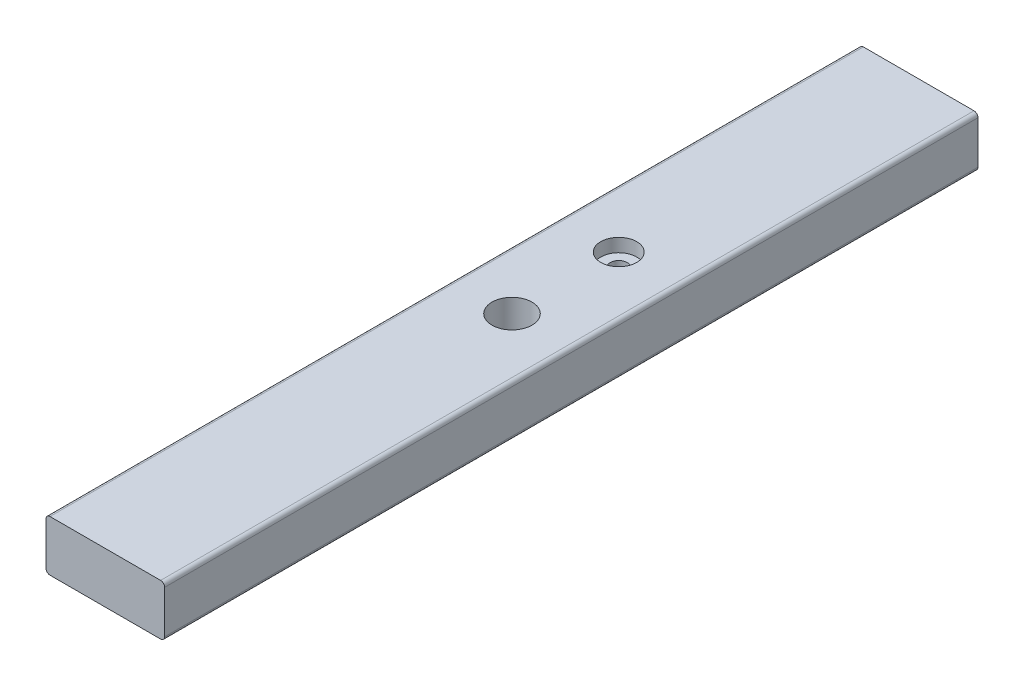
ISO-10303-21;
HEADER;
FILE_DESCRIPTION(('STEP AP214'),'2;1');
FILE_NAME('part.step','',(''),(''),'','','');
FILE_SCHEMA(('AUTOMOTIVE_DESIGN { 1 0 10303 214 1 1 1 1 }'));
ENDSEC;
DATA;
#1=APPLICATION_CONTEXT('core data for automotive mechanical design processes');
#2=APPLICATION_PROTOCOL_DEFINITION('international standard','automotive_design',2000,#1);
#3=PRODUCT_CONTEXT('',#1,'mechanical');
#4=PRODUCT('Part','Part','',(#3));
#5=PRODUCT_RELATED_PRODUCT_CATEGORY('part','',(#4));
#6=PRODUCT_DEFINITION_FORMATION('','',#4);
#7=PRODUCT_DEFINITION_CONTEXT('part definition',#1,'design');
#8=PRODUCT_DEFINITION('design','',#6,#7);
#9=PRODUCT_DEFINITION_SHAPE('','',#8);
#10=(LENGTH_UNIT() NAMED_UNIT(*) SI_UNIT(.MILLI.,.METRE.));
#11=(NAMED_UNIT(*) PLANE_ANGLE_UNIT() SI_UNIT($,.RADIAN.));
#12=(NAMED_UNIT(*) SI_UNIT($,.STERADIAN.) SOLID_ANGLE_UNIT());
#13=UNCERTAINTY_MEASURE_WITH_UNIT(LENGTH_MEASURE(1.E-05),#10,'distance_accuracy_value','');
#14=(GEOMETRIC_REPRESENTATION_CONTEXT(3) GLOBAL_UNCERTAINTY_ASSIGNED_CONTEXT((#13)) GLOBAL_UNIT_ASSIGNED_CONTEXT((#10,
#11,#12)) REPRESENTATION_CONTEXT('',''));
#15=CARTESIAN_POINT('',(0.,0.,0.));
#16=DIRECTION('',(0.,0.,1.));
#17=DIRECTION('',(1.,0.,0.));
#18=AXIS2_PLACEMENT_3D('',#15,#16,#17);
#19=CARTESIAN_POINT('',(0.,-19.05,224.8));
#20=DIRECTION('',(0.,1.,0.));
#21=DIRECTION('',(-1.,0.,0.));
#22=AXIS2_PLACEMENT_3D('',#19,#20,#21);
#23=CYLINDRICAL_SURFACE('',#22,6.34999999999999);
#24=CARTESIAN_POINT('',(0.,9.04999999999999,224.8));
#25=DIRECTION('',(0.,1.,0.));
#26=DIRECTION('',(-1.,0.,0.));
#27=AXIS2_PLACEMENT_3D('',#24,#25,#26);
#28=CIRCLE('',#27,6.34999999999999);
#29=CARTESIAN_POINT('',(-6.35,9.04999999999999,224.8));
#30=VERTEX_POINT('',#29);
#31=EDGE_CURVE('E161',#30,#30,#28,.F.);
#32=ORIENTED_EDGE('',*,*,#31,.F.);
#33=EDGE_LOOP('',(#32));
#34=FACE_BOUND('',#33,.T.);
#35=CARTESIAN_POINT('',(0.,-9.04999999999999,224.8));
#36=DIRECTION('',(0.,-1.,0.));
#37=DIRECTION('',(1.,0.,0.));
#38=AXIS2_PLACEMENT_3D('',#35,#36,#37);
#39=CIRCLE('',#38,6.34999999999999);
#40=CARTESIAN_POINT('',(6.35,-9.05,224.8));
#41=VERTEX_POINT('',#40);
#42=EDGE_CURVE('E40',#41,#41,#39,.F.);
#43=ORIENTED_EDGE('',*,*,#42,.F.);
#44=EDGE_LOOP('',(#43));
#45=FACE_BOUND('',#44,.T.);
#46=ADVANCED_FACE('F36',(#34,#45),#23,.F.);
#47=CARTESIAN_POINT('',(-41.45,-16.05,609.6));
#48=DIRECTION('',(0.,0.,-1.));
#49=DIRECTION('',(-1.,0.,0.));
#50=AXIS2_PLACEMENT_3D('',#47,#48,#49);
#51=CYLINDRICAL_SURFACE('',#50,3.);
#52=CARTESIAN_POINT('',(-41.45,-16.05,0.));
#53=DIRECTION('',(0.,0.,1.));
#54=DIRECTION('',(-1.,0.,0.));
#55=AXIS2_PLACEMENT_3D('',#52,#53,#54);
#56=CIRCLE('',#55,3.);
#57=CARTESIAN_POINT('',(-44.45,-16.05,0.));
#58=VERTEX_POINT('',#57);
#59=CARTESIAN_POINT('',(-41.45,-19.05,0.));
#60=VERTEX_POINT('',#59);
#61=EDGE_CURVE('E135',#58,#60,#56,.T.);
#62=ORIENTED_EDGE('',*,*,#61,.T.);
#63=DIRECTION('',(0.,0.,-1.));
#64=VECTOR('',#63,1.);
#65=CARTESIAN_POINT('',(-41.45,-19.05,609.6));
#66=LINE('',#65,#64);
#67=CARTESIAN_POINT('',(-41.45,-19.05,609.6));
#68=VERTEX_POINT('',#67);
#69=EDGE_CURVE('E11',#68,#60,#66,.T.);
#70=ORIENTED_EDGE('',*,*,#69,.F.);
#71=CARTESIAN_POINT('',(-41.45,-16.05,609.6));
#72=DIRECTION('',(0.,0.,1.));
#73=DIRECTION('',(-1.,0.,0.));
#74=AXIS2_PLACEMENT_3D('',#71,#72,#73);
#75=CIRCLE('',#74,3.);
#76=CARTESIAN_POINT('',(-44.45,-16.05,609.6));
#77=VERTEX_POINT('',#76);
#78=EDGE_CURVE('E150',#77,#68,#75,.T.);
#79=ORIENTED_EDGE('',*,*,#78,.F.);
#80=DIRECTION('',(0.,0.,-1.));
#81=VECTOR('',#80,1.);
#82=CARTESIAN_POINT('',(-44.45,-16.05,609.6));
#83=LINE('',#82,#81);
#84=EDGE_CURVE('E131',#77,#58,#83,.T.);
#85=ORIENTED_EDGE('',*,*,#84,.T.);
#86=EDGE_LOOP('',(#62,#70,#79,#85));
#87=FACE_BOUND('',#86,.T.);
#88=ADVANCED_FACE('F38',(#87),#51,.T.);
#89=CARTESIAN_POINT('',(41.45,-19.05,609.6));
#90=DIRECTION('',(0.,1.,0.));
#91=DIRECTION('',(-1.,0.,0.));
#92=AXIS2_PLACEMENT_3D('',#89,#90,#91);
#93=PLANE('',#92);
#94=CARTESIAN_POINT('',(0.,-19.05,224.8));
#95=DIRECTION('',(0.,1.,0.));
#96=DIRECTION('',(-1.,0.,0.));
#97=AXIS2_PLACEMENT_3D('',#94,#95,#96);
#98=CIRCLE('',#97,13.5001);
#99=CARTESIAN_POINT('',(-13.5001,-19.05,224.8));
#100=VERTEX_POINT('',#99);
#101=EDGE_CURVE('E177',#100,#100,#98,.T.);
#102=ORIENTED_EDGE('',*,*,#101,.T.);
#103=EDGE_LOOP('',(#102));
#104=FACE_BOUND('',#103,.T.);
#105=CARTESIAN_POINT('',(0.,-19.05,304.8));
#106=DIRECTION('',(0.,1.,0.));
#107=DIRECTION('',(-1.,0.,0.));
#108=AXIS2_PLACEMENT_3D('',#105,#106,#107);
#109=CIRCLE('',#108,15.);
#110=CARTESIAN_POINT('',(-15.,-19.05,304.8));
#111=VERTEX_POINT('',#110);
#112=EDGE_CURVE('E139',#111,#111,#109,.T.);
#113=ORIENTED_EDGE('',*,*,#112,.T.);
#114=EDGE_LOOP('',(#113));
#115=FACE_BOUND('',#114,.T.);
#116=DIRECTION('',(1.,0.,0.));
#117=VECTOR('',#116,1.);
#118=CARTESIAN_POINT('',(41.45,-19.05,0.));
#119=LINE('',#118,#117);
#120=CARTESIAN_POINT('',(41.45,-19.05,0.));
#121=VERTEX_POINT('',#120);
#122=EDGE_CURVE('E138',#60,#121,#119,.T.);
#123=ORIENTED_EDGE('',*,*,#122,.T.);
#124=DIRECTION('',(0.,0.,-1.));
#125=VECTOR('',#124,1.);
#126=CARTESIAN_POINT('',(41.45,-19.05,609.6));
#127=LINE('',#126,#125);
#128=CARTESIAN_POINT('',(41.45,-19.05,609.6));
#129=VERTEX_POINT('',#128);
#130=EDGE_CURVE('E46',#129,#121,#127,.T.);
#131=ORIENTED_EDGE('',*,*,#130,.F.);
#132=DIRECTION('',(1.,0.,0.));
#133=VECTOR('',#132,1.);
#134=CARTESIAN_POINT('',(41.45,-19.05,609.6));
#135=LINE('',#134,#133);
#136=EDGE_CURVE('E98',#68,#129,#135,.T.);
#137=ORIENTED_EDGE('',*,*,#136,.F.);
#138=ORIENTED_EDGE('',*,*,#69,.T.);
#139=EDGE_LOOP('',(#123,#131,#137,#138));
#140=FACE_BOUND('',#139,.T.);
#141=ADVANCED_FACE('F220',(#104,#115,#140),#93,.F.);
#142=CARTESIAN_POINT('',(41.45,-16.05,609.6));
#143=DIRECTION('',(0.,0.,-1.));
#144=DIRECTION('',(-1.,0.,0.));
#145=AXIS2_PLACEMENT_3D('',#142,#143,#144);
#146=CYLINDRICAL_SURFACE('',#145,3.);
#147=CARTESIAN_POINT('',(41.45,-16.05,0.));
#148=DIRECTION('',(0.,0.,1.));
#149=DIRECTION('',(1.,0.,0.));
#150=AXIS2_PLACEMENT_3D('',#147,#148,#149);
#151=CIRCLE('',#150,3.);
#152=CARTESIAN_POINT('',(44.45,-16.05,0.));
#153=VERTEX_POINT('',#152);
#154=EDGE_CURVE('E141',#121,#153,#151,.T.);
#155=ORIENTED_EDGE('',*,*,#154,.T.);
#156=DIRECTION('',(0.,0.,-1.));
#157=VECTOR('',#156,1.);
#158=CARTESIAN_POINT('',(44.45,-16.05,609.6));
#159=LINE('',#158,#157);
#160=CARTESIAN_POINT('',(44.45,-16.05,609.6));
#161=VERTEX_POINT('',#160);
#162=EDGE_CURVE('E157',#161,#153,#159,.T.);
#163=ORIENTED_EDGE('',*,*,#162,.F.);
#164=CARTESIAN_POINT('',(41.45,-16.05,609.6));
#165=DIRECTION('',(0.,0.,1.));
#166=DIRECTION('',(1.,0.,0.));
#167=AXIS2_PLACEMENT_3D('',#164,#165,#166);
#168=CIRCLE('',#167,3.);
#169=EDGE_CURVE('E184',#129,#161,#168,.T.);
#170=ORIENTED_EDGE('',*,*,#169,.F.);
#171=ORIENTED_EDGE('',*,*,#130,.T.);
#172=EDGE_LOOP('',(#155,#163,#170,#171));
#173=FACE_BOUND('',#172,.T.);
#174=ADVANCED_FACE('F251',(#173),#146,.T.);
#175=CARTESIAN_POINT('',(44.45,-16.05,609.6));
#176=DIRECTION('',(-1.,0.,0.));
#177=DIRECTION('',(0.,0.,1.));
#178=AXIS2_PLACEMENT_3D('',#175,#176,#177);
#179=PLANE('',#178);
#180=DIRECTION('',(0.,1.,0.));
#181=VECTOR('',#180,1.);
#182=CARTESIAN_POINT('',(44.45,-16.05,0.));
#183=LINE('',#182,#181);
#184=CARTESIAN_POINT('',(44.45,16.05,0.));
#185=VERTEX_POINT('',#184);
#186=EDGE_CURVE('E143',#153,#185,#183,.T.);
#187=ORIENTED_EDGE('',*,*,#186,.T.);
#188=DIRECTION('',(0.,0.,-1.));
#189=VECTOR('',#188,1.);
#190=CARTESIAN_POINT('',(44.45,16.05,609.6));
#191=LINE('',#190,#189);
#192=CARTESIAN_POINT('',(44.45,16.05,609.6));
#193=VERTEX_POINT('',#192);
#194=EDGE_CURVE('E154',#193,#185,#191,.T.);
#195=ORIENTED_EDGE('',*,*,#194,.F.);
#196=DIRECTION('',(0.,1.,0.));
#197=VECTOR('',#196,1.);
#198=CARTESIAN_POINT('',(44.45,-16.05,609.6));
#199=LINE('',#198,#197);
#200=EDGE_CURVE('E186',#161,#193,#199,.T.);
#201=ORIENTED_EDGE('',*,*,#200,.F.);
#202=ORIENTED_EDGE('',*,*,#162,.T.);
#203=EDGE_LOOP('',(#187,#195,#201,#202));
#204=FACE_BOUND('',#203,.T.);
#205=ADVANCED_FACE('F192',(#204),#179,.F.);
#206=CARTESIAN_POINT('',(41.45,16.05,609.6));
#207=DIRECTION('',(0.,0.,-1.));
#208=DIRECTION('',(-1.,0.,0.));
#209=AXIS2_PLACEMENT_3D('',#206,#207,#208);
#210=CYLINDRICAL_SURFACE('',#209,3.);
#211=CARTESIAN_POINT('',(41.45,16.05,0.));
#212=DIRECTION('',(0.,0.,1.));
#213=DIRECTION('',(1.,0.,0.));
#214=AXIS2_PLACEMENT_3D('',#211,#212,#213);
#215=CIRCLE('',#214,3.);
#216=CARTESIAN_POINT('',(41.45,19.05,0.));
#217=VERTEX_POINT('',#216);
#218=EDGE_CURVE('E145',#185,#217,#215,.T.);
#219=ORIENTED_EDGE('',*,*,#218,.T.);
#220=DIRECTION('',(0.,0.,-1.));
#221=VECTOR('',#220,1.);
#222=CARTESIAN_POINT('',(41.45,19.05,609.6));
#223=LINE('',#222,#221);
#224=CARTESIAN_POINT('',(41.45,19.05,609.6));
#225=VERTEX_POINT('',#224);
#226=EDGE_CURVE('E126',#225,#217,#223,.T.);
#227=ORIENTED_EDGE('',*,*,#226,.F.);
#228=CARTESIAN_POINT('',(41.45,16.05,609.6));
#229=DIRECTION('',(0.,0.,1.));
#230=DIRECTION('',(1.,0.,0.));
#231=AXIS2_PLACEMENT_3D('',#228,#229,#230);
#232=CIRCLE('',#231,3.);
#233=EDGE_CURVE('E117',#193,#225,#232,.T.);
#234=ORIENTED_EDGE('',*,*,#233,.F.);
#235=ORIENTED_EDGE('',*,*,#194,.T.);
#236=EDGE_LOOP('',(#219,#227,#234,#235));
#237=FACE_BOUND('',#236,.T.);
#238=ADVANCED_FACE('F196',(#237),#210,.T.);
#239=CARTESIAN_POINT('',(41.45,19.05,609.6));
#240=DIRECTION('',(0.,-1.,0.));
#241=DIRECTION('',(1.,0.,0.));
#242=AXIS2_PLACEMENT_3D('',#239,#240,#241);
#243=PLANE('',#242);
#244=CARTESIAN_POINT('',(0.,19.05,224.8));
#245=DIRECTION('',(0.,1.,0.));
#246=DIRECTION('',(-1.,0.,0.));
#247=AXIS2_PLACEMENT_3D('',#244,#245,#246);
#248=CIRCLE('',#247,13.5001);
#249=CARTESIAN_POINT('',(-13.5001,19.05,224.8));
#250=VERTEX_POINT('',#249);
#251=EDGE_CURVE('E170',#250,#250,#248,.T.);
#252=ORIENTED_EDGE('',*,*,#251,.F.);
#253=EDGE_LOOP('',(#252));
#254=FACE_BOUND('',#253,.T.);
#255=CARTESIAN_POINT('',(0.,19.05,304.8));
#256=DIRECTION('',(0.,1.,0.));
#257=DIRECTION('',(-1.,0.,0.));
#258=AXIS2_PLACEMENT_3D('',#255,#256,#257);
#259=CIRCLE('',#258,15.);
#260=CARTESIAN_POINT('',(-15.,19.05,304.8));
#261=VERTEX_POINT('',#260);
#262=EDGE_CURVE('E163',#261,#261,#259,.T.);
#263=ORIENTED_EDGE('',*,*,#262,.F.);
#264=EDGE_LOOP('',(#263));
#265=FACE_BOUND('',#264,.T.);
#266=DIRECTION('',(-1.,0.,0.));
#267=VECTOR('',#266,1.);
#268=CARTESIAN_POINT('',(41.45,19.05,0.));
#269=LINE('',#268,#267);
#270=CARTESIAN_POINT('',(-41.45,19.05,0.));
#271=VERTEX_POINT('',#270);
#272=EDGE_CURVE('E125',#217,#271,#269,.T.);
#273=ORIENTED_EDGE('',*,*,#272,.T.);
#274=DIRECTION('',(0.,0.,-1.));
#275=VECTOR('',#274,1.);
#276=CARTESIAN_POINT('',(-41.45,19.05,609.6));
#277=LINE('',#276,#275);
#278=CARTESIAN_POINT('',(-41.45,19.05,609.6));
#279=VERTEX_POINT('',#278);
#280=EDGE_CURVE('E122',#279,#271,#277,.T.);
#281=ORIENTED_EDGE('',*,*,#280,.F.);
#282=DIRECTION('',(-1.,0.,0.));
#283=VECTOR('',#282,1.);
#284=CARTESIAN_POINT('',(41.45,19.05,609.6));
#285=LINE('',#284,#283);
#286=EDGE_CURVE('E111',#225,#279,#285,.T.);
#287=ORIENTED_EDGE('',*,*,#286,.F.);
#288=ORIENTED_EDGE('',*,*,#226,.T.);
#289=EDGE_LOOP('',(#273,#281,#287,#288));
#290=FACE_BOUND('',#289,.T.);
#291=ADVANCED_FACE('F123',(#254,#265,#290),#243,.F.);
#292=CARTESIAN_POINT('',(-41.45,16.05,609.6));
#293=DIRECTION('',(0.,0.,-1.));
#294=DIRECTION('',(-1.,0.,0.));
#295=AXIS2_PLACEMENT_3D('',#292,#293,#294);
#296=CYLINDRICAL_SURFACE('',#295,3.);
#297=CARTESIAN_POINT('',(-41.45,16.05,0.));
#298=DIRECTION('',(0.,0.,1.));
#299=DIRECTION('',(1.,0.,0.));
#300=AXIS2_PLACEMENT_3D('',#297,#298,#299);
#301=CIRCLE('',#300,3.);
#302=CARTESIAN_POINT('',(-44.45,16.05,0.));
#303=VERTEX_POINT('',#302);
#304=EDGE_CURVE('E84',#271,#303,#301,.T.);
#305=ORIENTED_EDGE('',*,*,#304,.T.);
#306=DIRECTION('',(0.,0.,-1.));
#307=VECTOR('',#306,1.);
#308=CARTESIAN_POINT('',(-44.45,16.05,609.6));
#309=LINE('',#308,#307);
#310=CARTESIAN_POINT('',(-44.45,16.05,609.6));
#311=VERTEX_POINT('',#310);
#312=EDGE_CURVE('E127',#311,#303,#309,.T.);
#313=ORIENTED_EDGE('',*,*,#312,.F.);
#314=CARTESIAN_POINT('',(-41.45,16.05,609.6));
#315=DIRECTION('',(0.,0.,1.));
#316=DIRECTION('',(1.,0.,0.));
#317=AXIS2_PLACEMENT_3D('',#314,#315,#316);
#318=CIRCLE('',#317,3.);
#319=EDGE_CURVE('E115',#279,#311,#318,.T.);
#320=ORIENTED_EDGE('',*,*,#319,.F.);
#321=ORIENTED_EDGE('',*,*,#280,.T.);
#322=EDGE_LOOP('',(#305,#313,#320,#321));
#323=FACE_BOUND('',#322,.T.);
#324=ADVANCED_FACE('F129',(#323),#296,.T.);
#325=CARTESIAN_POINT('',(-44.45,-16.05,609.6));
#326=DIRECTION('',(1.,0.,0.));
#327=DIRECTION('',(0.,0.,-1.));
#328=AXIS2_PLACEMENT_3D('',#325,#326,#327);
#329=PLANE('',#328);
#330=DIRECTION('',(0.,-1.,0.));
#331=VECTOR('',#330,1.);
#332=CARTESIAN_POINT('',(-44.45,-16.05,0.));
#333=LINE('',#332,#331);
#334=EDGE_CURVE('E90',#303,#58,#333,.T.);
#335=ORIENTED_EDGE('',*,*,#334,.T.);
#336=ORIENTED_EDGE('',*,*,#84,.F.);
#337=DIRECTION('',(0.,-1.,0.));
#338=VECTOR('',#337,1.);
#339=CARTESIAN_POINT('',(-44.45,-16.05,609.6));
#340=LINE('',#339,#338);
#341=EDGE_CURVE('E55',#311,#77,#340,.T.);
#342=ORIENTED_EDGE('',*,*,#341,.F.);
#343=ORIENTED_EDGE('',*,*,#312,.T.);
#344=EDGE_LOOP('',(#335,#336,#342,#343));
#345=FACE_BOUND('',#344,.T.);
#346=ADVANCED_FACE('F204',(#345),#329,.F.);
#347=CARTESIAN_POINT('',(-41.45,-16.05,609.6));
#348=DIRECTION('',(0.,0.,-1.));
#349=DIRECTION('',(-1.,0.,0.));
#350=AXIS2_PLACEMENT_3D('',#347,#348,#349);
#351=PLANE('',#350);
#352=ORIENTED_EDGE('',*,*,#78,.T.);
#353=ORIENTED_EDGE('',*,*,#136,.T.);
#354=ORIENTED_EDGE('',*,*,#169,.T.);
#355=ORIENTED_EDGE('',*,*,#200,.T.);
#356=ORIENTED_EDGE('',*,*,#233,.T.);
#357=ORIENTED_EDGE('',*,*,#286,.T.);
#358=ORIENTED_EDGE('',*,*,#319,.T.);
#359=ORIENTED_EDGE('',*,*,#341,.T.);
#360=EDGE_LOOP('',(#352,#353,#354,#355,#356,#357,#358,#359));
#361=FACE_BOUND('',#360,.T.);
#362=ADVANCED_FACE('F113',(#361),#351,.F.);
#363=CARTESIAN_POINT('',(-41.45,-16.05,0.));
#364=DIRECTION('',(0.,0.,-1.));
#365=DIRECTION('',(-1.,0.,0.));
#366=AXIS2_PLACEMENT_3D('',#363,#364,#365);
#367=PLANE('',#366);
#368=ORIENTED_EDGE('',*,*,#61,.F.);
#369=ORIENTED_EDGE('',*,*,#334,.F.);
#370=ORIENTED_EDGE('',*,*,#304,.F.);
#371=ORIENTED_EDGE('',*,*,#272,.F.);
#372=ORIENTED_EDGE('',*,*,#218,.F.);
#373=ORIENTED_EDGE('',*,*,#186,.F.);
#374=ORIENTED_EDGE('',*,*,#154,.F.);
#375=ORIENTED_EDGE('',*,*,#122,.F.);
#376=EDGE_LOOP('',(#368,#369,#370,#371,#372,#373,#374,#375));
#377=FACE_BOUND('',#376,.T.);
#378=ADVANCED_FACE('F199',(#377),#367,.T.);
#379=CARTESIAN_POINT('',(0.,-19.05,304.8));
#380=DIRECTION('',(0.,1.,0.));
#381=DIRECTION('',(-1.,0.,0.));
#382=AXIS2_PLACEMENT_3D('',#379,#380,#381);
#383=CYLINDRICAL_SURFACE('',#382,15.);
#384=ORIENTED_EDGE('',*,*,#112,.F.);
#385=EDGE_LOOP('',(#384));
#386=FACE_BOUND('',#385,.T.);
#387=ORIENTED_EDGE('',*,*,#262,.T.);
#388=EDGE_LOOP('',(#387));
#389=FACE_BOUND('',#388,.T.);
#390=ADVANCED_FACE('F223',(#386,#389),#383,.F.);
#391=CARTESIAN_POINT('',(0.,9.04999999999999,224.8));
#392=DIRECTION('',(0.,1.,0.));
#393=DIRECTION('',(-1.,0.,0.));
#394=AXIS2_PLACEMENT_3D('',#391,#392,#393);
#395=PLANE('',#394);
#396=CARTESIAN_POINT('',(0.,9.04999999999999,224.8));
#397=DIRECTION('',(0.,1.,0.));
#398=DIRECTION('',(-1.,0.,0.));
#399=AXIS2_PLACEMENT_3D('',#396,#397,#398);
#400=CIRCLE('',#399,13.5001);
#401=CARTESIAN_POINT('',(-13.5001,9.04999999999999,224.8));
#402=VERTEX_POINT('',#401);
#403=EDGE_CURVE('E164',#402,#402,#400,.T.);
#404=ORIENTED_EDGE('',*,*,#403,.T.);
#405=EDGE_LOOP('',(#404));
#406=FACE_BOUND('',#405,.T.);
#407=ORIENTED_EDGE('',*,*,#31,.T.);
#408=EDGE_LOOP('',(#407));
#409=FACE_BOUND('',#408,.T.);
#410=ADVANCED_FACE('F229',(#406,#409),#395,.T.);
#411=CARTESIAN_POINT('',(0.,9.04999999999999,224.8));
#412=DIRECTION('',(0.,1.,0.));
#413=DIRECTION('',(-1.,0.,0.));
#414=AXIS2_PLACEMENT_3D('',#411,#412,#413);
#415=CYLINDRICAL_SURFACE('',#414,13.5001);
#416=ORIENTED_EDGE('',*,*,#403,.F.);
#417=EDGE_LOOP('',(#416));
#418=FACE_BOUND('',#417,.T.);
#419=ORIENTED_EDGE('',*,*,#251,.T.);
#420=EDGE_LOOP('',(#419));
#421=FACE_BOUND('',#420,.T.);
#422=ADVANCED_FACE('F234',(#418,#421),#415,.F.);
#423=CARTESIAN_POINT('',(0.,-9.04999999999999,224.8));
#424=DIRECTION('',(0.,-1.,0.));
#425=DIRECTION('',(-1.,0.,0.));
#426=AXIS2_PLACEMENT_3D('',#423,#424,#425);
#427=PLANE('',#426);
#428=CARTESIAN_POINT('',(0.,-9.04999999999999,224.8));
#429=DIRECTION('',(0.,1.,0.));
#430=DIRECTION('',(-1.,0.,0.));
#431=AXIS2_PLACEMENT_3D('',#428,#429,#430);
#432=CIRCLE('',#431,13.5001);
#433=CARTESIAN_POINT('',(-13.5001,-9.04999999999999,224.8));
#434=VERTEX_POINT('',#433);
#435=EDGE_CURVE('E262',#434,#434,#432,.T.);
#436=ORIENTED_EDGE('',*,*,#435,.F.);
#437=EDGE_LOOP('',(#436));
#438=FACE_BOUND('',#437,.T.);
#439=ORIENTED_EDGE('',*,*,#42,.T.);
#440=EDGE_LOOP('',(#439));
#441=FACE_BOUND('',#440,.T.);
#442=ADVANCED_FACE('F269',(#438,#441),#427,.T.);
#443=CARTESIAN_POINT('',(0.,-9.04999999999999,224.8));
#444=DIRECTION('',(0.,-1.,0.));
#445=DIRECTION('',(1.,0.,0.));
#446=AXIS2_PLACEMENT_3D('',#443,#444,#445);
#447=CYLINDRICAL_SURFACE('',#446,13.5001);
#448=ORIENTED_EDGE('',*,*,#435,.T.);
#449=EDGE_LOOP('',(#448));
#450=FACE_BOUND('',#449,.T.);
#451=ORIENTED_EDGE('',*,*,#101,.F.);
#452=EDGE_LOOP('',(#451));
#453=FACE_BOUND('',#452,.T.);
#454=ADVANCED_FACE('F271',(#450,#453),#447,.F.);
#455=CLOSED_SHELL('',(#46,#88,#141,#174,#205,#238,#291,#324,#346,#362,#378,#390,#410,#422,#442,#454));
#456=MANIFOLD_SOLID_BREP('B2',#455);
#457=ADVANCED_BREP_SHAPE_REPRESENTATION('',(#18,#456),#14);
#458=SHAPE_DEFINITION_REPRESENTATION(#9,#457);
ENDSEC;
END-ISO-10303-21;
